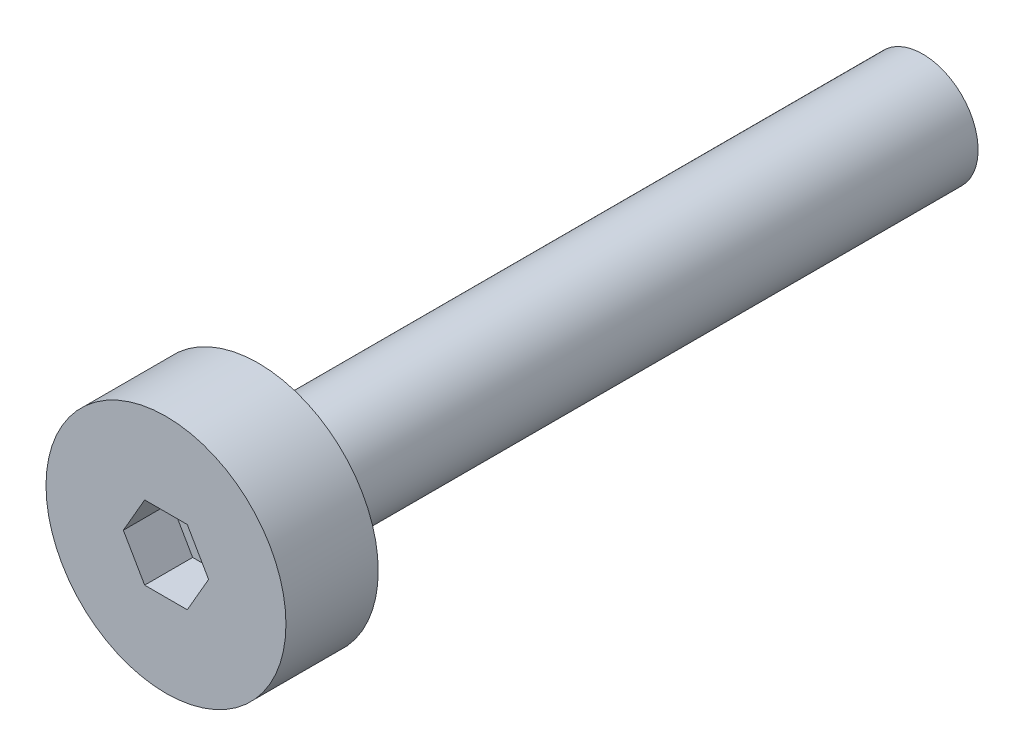
ISO-10303-21;
HEADER;
FILE_DESCRIPTION(('STEP AP214'),'2;1');
FILE_NAME('part.step','',(''),(''),'','','');
FILE_SCHEMA(('AUTOMOTIVE_DESIGN { 1 0 10303 214 1 1 1 1 }'));
ENDSEC;
DATA;
#1=APPLICATION_CONTEXT('core data for automotive mechanical design processes');
#2=APPLICATION_PROTOCOL_DEFINITION('international standard','automotive_design',2000,#1);
#3=PRODUCT_CONTEXT('',#1,'mechanical');
#4=PRODUCT('Part','Part','',(#3));
#5=PRODUCT_RELATED_PRODUCT_CATEGORY('part','',(#4));
#6=PRODUCT_DEFINITION_FORMATION('','',#4);
#7=PRODUCT_DEFINITION_CONTEXT('part definition',#1,'design');
#8=PRODUCT_DEFINITION('design','',#6,#7);
#9=PRODUCT_DEFINITION_SHAPE('','',#8);
#10=(LENGTH_UNIT() NAMED_UNIT(*) SI_UNIT(.MILLI.,.METRE.));
#11=(NAMED_UNIT(*) PLANE_ANGLE_UNIT() SI_UNIT($,.RADIAN.));
#12=(NAMED_UNIT(*) SI_UNIT($,.STERADIAN.) SOLID_ANGLE_UNIT());
#13=UNCERTAINTY_MEASURE_WITH_UNIT(LENGTH_MEASURE(1.E-05),#10,'distance_accuracy_value','');
#14=(GEOMETRIC_REPRESENTATION_CONTEXT(3) GLOBAL_UNCERTAINTY_ASSIGNED_CONTEXT((#13)) GLOBAL_UNIT_ASSIGNED_CONTEXT((#10,
#11,#12)) REPRESENTATION_CONTEXT('',''));
#15=CARTESIAN_POINT('',(0.,0.,0.));
#16=DIRECTION('',(0.,0.,1.));
#17=DIRECTION('',(1.,0.,0.));
#18=AXIS2_PLACEMENT_3D('',#15,#16,#17);
#19=CARTESIAN_POINT('',(0.,0.,1.2));
#20=DIRECTION('',(0.,0.,1.));
#21=DIRECTION('',(1.,0.,0.));
#22=AXIS2_PLACEMENT_3D('',#19,#20,#21);
#23=PLANE('',#22);
#24=DIRECTION('',(-0.50000000000019,0.866025403784329,0.));
#25=VECTOR('',#24,1.);
#26=CARTESIAN_POINT('',(1.154700538379,0.,1.2));
#27=LINE('',#26,#25);
#28=CARTESIAN_POINT('',(1.154700538379,0.,1.2));
#29=VERTEX_POINT('',#28);
#30=CARTESIAN_POINT('',(0.57735026919,1.,1.2));
#31=VERTEX_POINT('',#30);
#32=EDGE_CURVE('E10',#29,#31,#27,.T.);
#33=ORIENTED_EDGE('',*,*,#32,.T.);
#34=DIRECTION('',(-1.,0.,0.));
#35=VECTOR('',#34,1.);
#36=CARTESIAN_POINT('',(0.57735026919,1.,1.2));
#37=LINE('',#36,#35);
#38=CARTESIAN_POINT('',(-0.57735026919,1.,1.2));
#39=VERTEX_POINT('',#38);
#40=EDGE_CURVE('E135',#31,#39,#37,.T.);
#41=ORIENTED_EDGE('',*,*,#40,.T.);
#42=DIRECTION('',(-0.50000000000019,-0.866025403784329,0.));
#43=VECTOR('',#42,1.);
#44=CARTESIAN_POINT('',(-0.57735026919,1.,1.2));
#45=LINE('',#44,#43);
#46=CARTESIAN_POINT('',(-1.154700538379,0.,1.2));
#47=VERTEX_POINT('',#46);
#48=EDGE_CURVE('E106',#39,#47,#45,.T.);
#49=ORIENTED_EDGE('',*,*,#48,.T.);
#50=DIRECTION('',(0.50000000000019,-0.866025403784329,0.));
#51=VECTOR('',#50,1.);
#52=CARTESIAN_POINT('',(-1.154700538379,0.,1.2));
#53=LINE('',#52,#51);
#54=CARTESIAN_POINT('',(-0.57735026919,-1.,1.2));
#55=VERTEX_POINT('',#54);
#56=EDGE_CURVE('E19',#47,#55,#53,.T.);
#57=ORIENTED_EDGE('',*,*,#56,.T.);
#58=DIRECTION('',(1.,0.,0.));
#59=VECTOR('',#58,1.);
#60=CARTESIAN_POINT('',(-0.57735026919,-1.,1.2));
#61=LINE('',#60,#59);
#62=CARTESIAN_POINT('',(0.57735026919,-1.,1.2));
#63=VERTEX_POINT('',#62);
#64=EDGE_CURVE('E175',#55,#63,#61,.T.);
#65=ORIENTED_EDGE('',*,*,#64,.T.);
#66=DIRECTION('',(0.50000000000019,0.866025403784329,0.));
#67=VECTOR('',#66,1.);
#68=CARTESIAN_POINT('',(0.57735026919,-1.,1.2));
#69=LINE('',#68,#67);
#70=EDGE_CURVE('E137',#63,#29,#69,.T.);
#71=ORIENTED_EDGE('',*,*,#70,.T.);
#72=EDGE_LOOP('',(#33,#41,#49,#57,#65,#71));
#73=FACE_BOUND('',#72,.T.);
#74=ADVANCED_FACE('F15',(#73),#23,.T.);
#75=CARTESIAN_POINT('',(0.,0.,-18.));
#76=DIRECTION('',(0.,0.,-1.));
#77=DIRECTION('',(0.,-1.,0.));
#78=AXIS2_PLACEMENT_3D('',#75,#76,#77);
#79=PLANE('',#78);
#80=CARTESIAN_POINT('',(0.,0.,-18.));
#81=DIRECTION('',(0.,0.,-1.));
#82=DIRECTION('',(-1.,0.,0.));
#83=AXIS2_PLACEMENT_3D('',#80,#81,#82);
#84=CIRCLE('',#83,1.5);
#85=CARTESIAN_POINT('',(-1.5,0.,-18.));
#86=VERTEX_POINT('',#85);
#87=EDGE_CURVE('E141',#86,#86,#84,.T.);
#88=ORIENTED_EDGE('',*,*,#87,.T.);
#89=EDGE_LOOP('',(#88));
#90=FACE_BOUND('',#89,.T.);
#91=ADVANCED_FACE('F252',(#90),#79,.T.);
#92=CARTESIAN_POINT('',(1.154700538379,0.,1.2));
#93=DIRECTION('',(-0.866025403784329,-0.50000000000019,0.));
#94=DIRECTION('',(-0.50000000000019,0.866025403784329,0.));
#95=AXIS2_PLACEMENT_3D('',#92,#93,#94);
#96=PLANE('',#95);
#97=ORIENTED_EDGE('',*,*,#32,.F.);
#98=DIRECTION('',(0.,0.,1.));
#99=VECTOR('',#98,1.);
#100=CARTESIAN_POINT('',(1.154700538379,0.,1.2));
#101=LINE('',#100,#99);
#102=CARTESIAN_POINT('',(1.154700538379,0.,2.5));
#103=VERTEX_POINT('',#102);
#104=EDGE_CURVE('E184',#29,#103,#101,.T.);
#105=ORIENTED_EDGE('',*,*,#104,.T.);
#106=DIRECTION('',(-0.50000000000019,0.866025403784329,0.));
#107=VECTOR('',#106,1.);
#108=CARTESIAN_POINT('',(1.010362971082,0.25,2.5));
#109=LINE('',#108,#107);
#110=CARTESIAN_POINT('',(0.57735026919,1.,2.5));
#111=VERTEX_POINT('',#110);
#112=EDGE_CURVE('E171',#103,#111,#109,.T.);
#113=ORIENTED_EDGE('',*,*,#112,.T.);
#114=DIRECTION('',(0.,0.,1.));
#115=VECTOR('',#114,1.);
#116=CARTESIAN_POINT('',(0.57735026919,1.,1.2));
#117=LINE('',#116,#115);
#118=EDGE_CURVE('E26',#31,#111,#117,.T.);
#119=ORIENTED_EDGE('',*,*,#118,.F.);
#120=EDGE_LOOP('',(#97,#105,#113,#119));
#121=FACE_BOUND('',#120,.T.);
#122=ADVANCED_FACE('F199',(#121),#96,.T.);
#123=CARTESIAN_POINT('',(0.57735026919,1.,1.2));
#124=DIRECTION('',(0.,-1.,0.));
#125=DIRECTION('',(-1.,0.,0.));
#126=AXIS2_PLACEMENT_3D('',#123,#124,#125);
#127=PLANE('',#126);
#128=ORIENTED_EDGE('',*,*,#40,.F.);
#129=ORIENTED_EDGE('',*,*,#118,.T.);
#130=DIRECTION('',(-1.,0.,0.));
#131=VECTOR('',#130,1.);
#132=CARTESIAN_POINT('',(0.288675134595,1.,2.5));
#133=LINE('',#132,#131);
#134=CARTESIAN_POINT('',(-0.57735026919,1.,2.5));
#135=VERTEX_POINT('',#134);
#136=EDGE_CURVE('E117',#111,#135,#133,.T.);
#137=ORIENTED_EDGE('',*,*,#136,.T.);
#138=DIRECTION('',(0.,0.,1.));
#139=VECTOR('',#138,1.);
#140=CARTESIAN_POINT('',(-0.57735026919,1.,1.2));
#141=LINE('',#140,#139);
#142=EDGE_CURVE('E112',#39,#135,#141,.T.);
#143=ORIENTED_EDGE('',*,*,#142,.F.);
#144=EDGE_LOOP('',(#128,#129,#137,#143));
#145=FACE_BOUND('',#144,.T.);
#146=ADVANCED_FACE('F204',(#145),#127,.T.);
#147=CARTESIAN_POINT('',(-0.57735026919,1.,1.2));
#148=DIRECTION('',(0.866025403784329,-0.50000000000019,0.));
#149=DIRECTION('',(0.,0.,-1.));
#150=AXIS2_PLACEMENT_3D('',#147,#148,#149);
#151=PLANE('',#150);
#152=ORIENTED_EDGE('',*,*,#48,.F.);
#153=ORIENTED_EDGE('',*,*,#142,.T.);
#154=DIRECTION('',(-0.50000000000019,-0.866025403784329,0.));
#155=VECTOR('',#154,1.);
#156=CARTESIAN_POINT('',(-0.721687836487,0.75,2.5));
#157=LINE('',#156,#155);
#158=CARTESIAN_POINT('',(-1.154700538379,0.,2.5));
#159=VERTEX_POINT('',#158);
#160=EDGE_CURVE('E109',#135,#159,#157,.T.);
#161=ORIENTED_EDGE('',*,*,#160,.T.);
#162=DIRECTION('',(0.,0.,1.));
#163=VECTOR('',#162,1.);
#164=CARTESIAN_POINT('',(-1.154700538379,0.,1.2));
#165=LINE('',#164,#163);
#166=EDGE_CURVE('E97',#47,#159,#165,.T.);
#167=ORIENTED_EDGE('',*,*,#166,.F.);
#168=EDGE_LOOP('',(#152,#153,#161,#167));
#169=FACE_BOUND('',#168,.T.);
#170=ADVANCED_FACE('F110',(#169),#151,.T.);
#171=CARTESIAN_POINT('',(-1.154700538379,0.,1.2));
#172=DIRECTION('',(0.866025403784329,0.50000000000019,0.));
#173=DIRECTION('',(0.,0.,-1.));
#174=AXIS2_PLACEMENT_3D('',#171,#172,#173);
#175=PLANE('',#174);
#176=ORIENTED_EDGE('',*,*,#56,.F.);
#177=ORIENTED_EDGE('',*,*,#166,.T.);
#178=DIRECTION('',(0.50000000000019,-0.866025403784329,0.));
#179=VECTOR('',#178,1.);
#180=CARTESIAN_POINT('',(-1.010362971082,-0.25,2.5));
#181=LINE('',#180,#179);
#182=CARTESIAN_POINT('',(-0.57735026919,-1.,2.5));
#183=VERTEX_POINT('',#182);
#184=EDGE_CURVE('E101',#159,#183,#181,.T.);
#185=ORIENTED_EDGE('',*,*,#184,.T.);
#186=DIRECTION('',(0.,0.,1.));
#187=VECTOR('',#186,1.);
#188=CARTESIAN_POINT('',(-0.57735026919,-1.,1.2));
#189=LINE('',#188,#187);
#190=EDGE_CURVE('E172',#55,#183,#189,.T.);
#191=ORIENTED_EDGE('',*,*,#190,.F.);
#192=EDGE_LOOP('',(#176,#177,#185,#191));
#193=FACE_BOUND('',#192,.T.);
#194=ADVANCED_FACE('F17',(#193),#175,.T.);
#195=CARTESIAN_POINT('',(-0.57735026919,-1.,1.2));
#196=DIRECTION('',(0.,1.,0.));
#197=DIRECTION('',(1.,0.,0.));
#198=AXIS2_PLACEMENT_3D('',#195,#196,#197);
#199=PLANE('',#198);
#200=ORIENTED_EDGE('',*,*,#64,.F.);
#201=ORIENTED_EDGE('',*,*,#190,.T.);
#202=DIRECTION('',(1.,0.,0.));
#203=VECTOR('',#202,1.);
#204=CARTESIAN_POINT('',(-0.288675134595,-1.,2.5));
#205=LINE('',#204,#203);
#206=CARTESIAN_POINT('',(0.57735026919,-1.,2.5));
#207=VERTEX_POINT('',#206);
#208=EDGE_CURVE('E122',#183,#207,#205,.T.);
#209=ORIENTED_EDGE('',*,*,#208,.T.);
#210=DIRECTION('',(0.,0.,1.));
#211=VECTOR('',#210,1.);
#212=CARTESIAN_POINT('',(0.57735026919,-1.,1.2));
#213=LINE('',#212,#211);
#214=EDGE_CURVE('E139',#63,#207,#213,.T.);
#215=ORIENTED_EDGE('',*,*,#214,.F.);
#216=EDGE_LOOP('',(#200,#201,#209,#215));
#217=FACE_BOUND('',#216,.T.);
#218=ADVANCED_FACE('F193',(#217),#199,.T.);
#219=CARTESIAN_POINT('',(0.57735026919,-1.,1.2));
#220=DIRECTION('',(-0.866025403784329,0.50000000000019,0.));
#221=DIRECTION('',(0.,0.,1.));
#222=AXIS2_PLACEMENT_3D('',#219,#220,#221);
#223=PLANE('',#222);
#224=ORIENTED_EDGE('',*,*,#70,.F.);
#225=ORIENTED_EDGE('',*,*,#214,.T.);
#226=DIRECTION('',(0.50000000000019,0.866025403784329,0.));
#227=VECTOR('',#226,1.);
#228=CARTESIAN_POINT('',(0.721687836487,-0.75,2.5));
#229=LINE('',#228,#227);
#230=EDGE_CURVE('E145',#207,#103,#229,.T.);
#231=ORIENTED_EDGE('',*,*,#230,.T.);
#232=ORIENTED_EDGE('',*,*,#104,.F.);
#233=EDGE_LOOP('',(#224,#225,#231,#232));
#234=FACE_BOUND('',#233,.T.);
#235=ADVANCED_FACE('F196',(#234),#223,.T.);
#236=CARTESIAN_POINT('',(0.,0.,0.));
#237=DIRECTION('',(0.,0.,-1.));
#238=DIRECTION('',(-1.,0.,0.));
#239=AXIS2_PLACEMENT_3D('',#236,#237,#238);
#240=CYLINDRICAL_SURFACE('',#239,1.5);
#241=ORIENTED_EDGE('',*,*,#87,.F.);
#242=DIRECTION('',(0.,0.,-1.));
#243=VECTOR('',#242,1.);
#244=CARTESIAN_POINT('',(-1.5,0.,0.));
#245=LINE('',#244,#243);
#246=CARTESIAN_POINT('',(-1.5,0.,0.));
#247=VERTEX_POINT('',#246);
#248=EDGE_CURVE('E133',#247,#86,#245,.T.);
#249=ORIENTED_EDGE('',*,*,#248,.F.);
#250=CARTESIAN_POINT('',(0.,0.,0.));
#251=DIRECTION('',(0.,0.,-1.));
#252=DIRECTION('',(-1.,0.,0.));
#253=AXIS2_PLACEMENT_3D('',#250,#251,#252);
#254=CIRCLE('',#253,1.5);
#255=EDGE_CURVE('E129',#247,#247,#254,.T.);
#256=ORIENTED_EDGE('',*,*,#255,.T.);
#257=ORIENTED_EDGE('',*,*,#248,.T.);
#258=EDGE_LOOP('',(#241,#249,#256,#257));
#259=FACE_BOUND('',#258,.T.);
#260=ADVANCED_FACE('F269',(#259),#240,.T.);
#261=CARTESIAN_POINT('',(0.,0.,2.5));
#262=DIRECTION('',(0.,0.,-1.));
#263=DIRECTION('',(0.,-1.,0.));
#264=AXIS2_PLACEMENT_3D('',#261,#262,#263);
#265=PLANE('',#264);
#266=ORIENTED_EDGE('',*,*,#208,.F.);
#267=ORIENTED_EDGE('',*,*,#184,.F.);
#268=ORIENTED_EDGE('',*,*,#160,.F.);
#269=ORIENTED_EDGE('',*,*,#136,.F.);
#270=ORIENTED_EDGE('',*,*,#112,.F.);
#271=ORIENTED_EDGE('',*,*,#230,.F.);
#272=EDGE_LOOP('',(#266,#267,#268,#269,#270,#271));
#273=FACE_BOUND('',#272,.T.);
#274=CARTESIAN_POINT('',(0.,0.,2.5));
#275=DIRECTION('',(0.,0.,-1.));
#276=DIRECTION('',(-1.,0.,0.));
#277=AXIS2_PLACEMENT_3D('',#274,#275,#276);
#278=CIRCLE('',#277,3.25);
#279=CARTESIAN_POINT('',(-3.25,0.,2.5));
#280=VERTEX_POINT('',#279);
#281=EDGE_CURVE('E154',#280,#280,#278,.T.);
#282=ORIENTED_EDGE('',*,*,#281,.F.);
#283=EDGE_LOOP('',(#282));
#284=FACE_BOUND('',#283,.T.);
#285=ADVANCED_FACE('F118',(#273,#284),#265,.F.);
#286=CARTESIAN_POINT('',(0.,0.,0.));
#287=DIRECTION('',(0.,0.,-1.));
#288=DIRECTION('',(0.,-1.,0.));
#289=AXIS2_PLACEMENT_3D('',#286,#287,#288);
#290=PLANE('',#289);
#291=ORIENTED_EDGE('',*,*,#255,.F.);
#292=EDGE_LOOP('',(#291));
#293=FACE_BOUND('',#292,.T.);
#294=CARTESIAN_POINT('',(0.,0.,0.));
#295=DIRECTION('',(0.,0.,-1.));
#296=DIRECTION('',(-1.,0.,0.));
#297=AXIS2_PLACEMENT_3D('',#294,#295,#296);
#298=CIRCLE('',#297,3.25);
#299=CARTESIAN_POINT('',(-3.25,0.,0.));
#300=VERTEX_POINT('',#299);
#301=EDGE_CURVE('E146',#300,#300,#298,.T.);
#302=ORIENTED_EDGE('',*,*,#301,.T.);
#303=EDGE_LOOP('',(#302));
#304=FACE_BOUND('',#303,.T.);
#305=ADVANCED_FACE('F267',(#293,#304),#290,.T.);
#306=CARTESIAN_POINT('',(0.,0.,2.5));
#307=DIRECTION('',(0.,0.,-1.));
#308=DIRECTION('',(-1.,0.,0.));
#309=AXIS2_PLACEMENT_3D('',#306,#307,#308);
#310=CYLINDRICAL_SURFACE('',#309,3.25);
#311=ORIENTED_EDGE('',*,*,#301,.F.);
#312=DIRECTION('',(0.,0.,-1.));
#313=VECTOR('',#312,1.);
#314=CARTESIAN_POINT('',(-3.25,0.,2.5));
#315=LINE('',#314,#313);
#316=EDGE_CURVE('E149',#280,#300,#315,.T.);
#317=ORIENTED_EDGE('',*,*,#316,.F.);
#318=ORIENTED_EDGE('',*,*,#281,.T.);
#319=ORIENTED_EDGE('',*,*,#316,.T.);
#320=EDGE_LOOP('',(#311,#317,#318,#319));
#321=FACE_BOUND('',#320,.T.);
#322=ADVANCED_FACE('F264',(#321),#310,.T.);
#323=CLOSED_SHELL('',(#74,#91,#122,#146,#170,#194,#218,#235,#260,#285,#305,#322));
#324=MANIFOLD_SOLID_BREP('B1',#323);
#325=ADVANCED_BREP_SHAPE_REPRESENTATION('',(#18,#324),#14);
#326=SHAPE_DEFINITION_REPRESENTATION(#9,#325);
ENDSEC;
END-ISO-10303-21;
